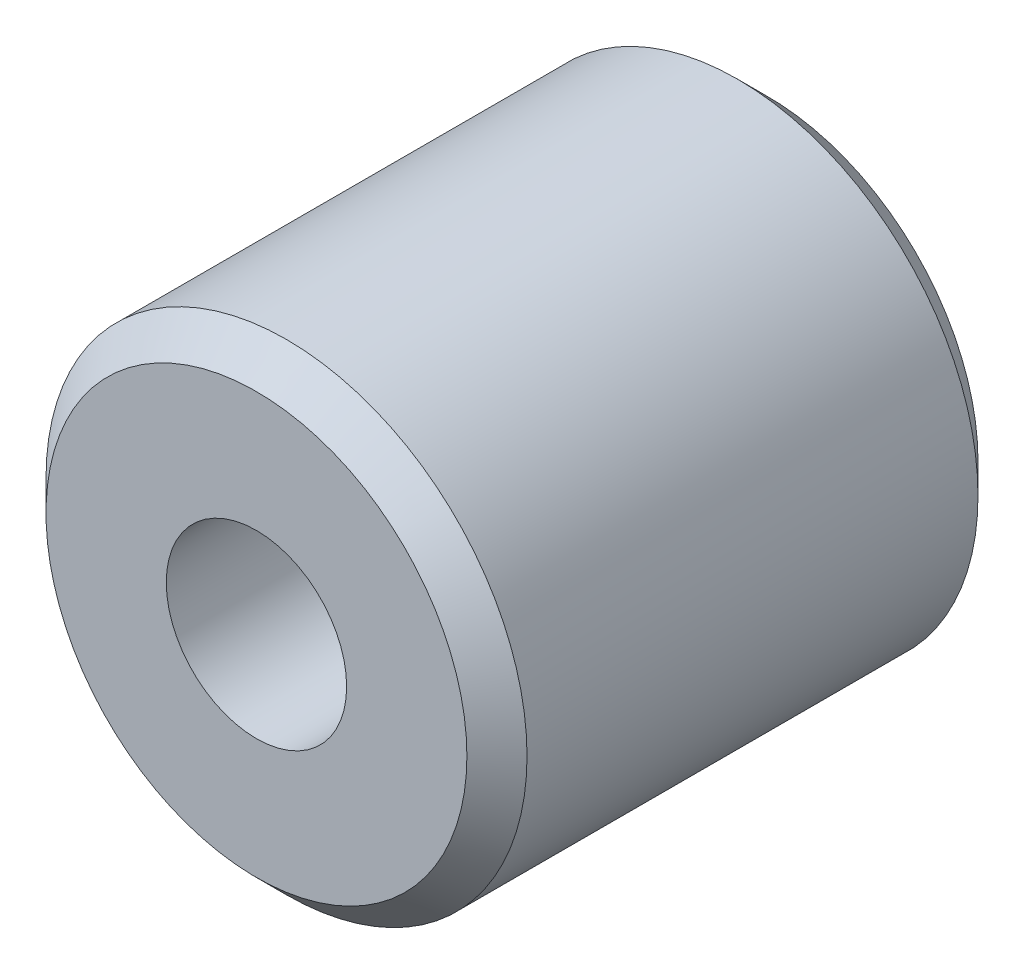
ISO-10303-21;
HEADER;
FILE_DESCRIPTION(('STEP AP214'),'2;1');
FILE_NAME('part.step','',(''),(''),'','','');
FILE_SCHEMA(('AUTOMOTIVE_DESIGN { 1 0 10303 214 1 1 1 1 }'));
ENDSEC;
DATA;
#1=APPLICATION_CONTEXT('core data for automotive mechanical design processes');
#2=APPLICATION_PROTOCOL_DEFINITION('international standard','automotive_design',2000,#1);
#3=PRODUCT_CONTEXT('',#1,'mechanical');
#4=PRODUCT('Part','Part','',(#3));
#5=PRODUCT_RELATED_PRODUCT_CATEGORY('part','',(#4));
#6=PRODUCT_DEFINITION_FORMATION('','',#4);
#7=PRODUCT_DEFINITION_CONTEXT('part definition',#1,'design');
#8=PRODUCT_DEFINITION('design','',#6,#7);
#9=PRODUCT_DEFINITION_SHAPE('','',#8);
#10=(LENGTH_UNIT() NAMED_UNIT(*) SI_UNIT(.MILLI.,.METRE.));
#11=(NAMED_UNIT(*) PLANE_ANGLE_UNIT() SI_UNIT($,.RADIAN.));
#12=(NAMED_UNIT(*) SI_UNIT($,.STERADIAN.) SOLID_ANGLE_UNIT());
#13=UNCERTAINTY_MEASURE_WITH_UNIT(LENGTH_MEASURE(1.E-05),#10,'distance_accuracy_value','');
#14=(GEOMETRIC_REPRESENTATION_CONTEXT(3) GLOBAL_UNCERTAINTY_ASSIGNED_CONTEXT((#13)) GLOBAL_UNIT_ASSIGNED_CONTEXT((#10,
#11,#12)) REPRESENTATION_CONTEXT('',''));
#15=CARTESIAN_POINT('',(0.,0.,0.));
#16=DIRECTION('',(0.,0.,1.));
#17=DIRECTION('',(1.,0.,0.));
#18=AXIS2_PLACEMENT_3D('',#15,#16,#17);
#19=CARTESIAN_POINT('',(0.,0.,-8.5));
#20=DIRECTION('',(0.,0.,1.));
#21=DIRECTION('',(1.,0.,0.));
#22=AXIS2_PLACEMENT_3D('',#19,#20,#21);
#23=CYLINDRICAL_SURFACE('',#22,4.);
#24=CARTESIAN_POINT('',(0.,0.,-0.500000000000002));
#25=DIRECTION('',(0.,0.,1.));
#26=DIRECTION('',(1.,0.,0.));
#27=AXIS2_PLACEMENT_3D('',#24,#25,#26);
#28=CIRCLE('',#27,4.);
#29=CARTESIAN_POINT('',(4.,0.,-0.500000000000002));
#30=VERTEX_POINT('',#29);
#31=EDGE_CURVE('E50',#30,#30,#28,.F.);
#32=ORIENTED_EDGE('',*,*,#31,.T.);
#33=EDGE_LOOP('',(#32));
#34=FACE_BOUND('',#33,.T.);
#35=CARTESIAN_POINT('',(0.,0.,-8.));
#36=DIRECTION('',(0.,0.,1.));
#37=DIRECTION('',(1.,0.,0.));
#38=AXIS2_PLACEMENT_3D('',#35,#36,#37);
#39=CIRCLE('',#38,4.);
#40=CARTESIAN_POINT('',(4.,0.,-8.));
#41=VERTEX_POINT('',#40);
#42=EDGE_CURVE('E51',#41,#41,#39,.T.);
#43=ORIENTED_EDGE('',*,*,#42,.T.);
#44=EDGE_LOOP('',(#43));
#45=FACE_BOUND('',#44,.T.);
#46=ADVANCED_FACE('F39',(#34,#45),#23,.T.);
#47=CARTESIAN_POINT('',(0.,0.,-8.5));
#48=DIRECTION('',(0.,0.,1.));
#49=DIRECTION('',(1.,0.,0.));
#50=AXIS2_PLACEMENT_3D('',#47,#48,#49);
#51=PLANE('',#50);
#52=CARTESIAN_POINT('',(0.,0.,-8.5));
#53=DIRECTION('',(0.,0.,1.));
#54=DIRECTION('',(1.,0.,0.));
#55=AXIS2_PLACEMENT_3D('',#52,#53,#54);
#56=CIRCLE('',#55,3.5);
#57=CARTESIAN_POINT('',(3.5,0.,-8.5));
#58=VERTEX_POINT('',#57);
#59=EDGE_CURVE('E10',#58,#58,#56,.F.);
#60=ORIENTED_EDGE('',*,*,#59,.T.);
#61=EDGE_LOOP('',(#60));
#62=FACE_BOUND('',#61,.T.);
#63=CARTESIAN_POINT('',(0.,0.,-8.5));
#64=DIRECTION('',(0.,0.,1.));
#65=DIRECTION('',(1.,0.,0.));
#66=AXIS2_PLACEMENT_3D('',#63,#64,#65);
#67=CIRCLE('',#66,1.5);
#68=CARTESIAN_POINT('',(1.5,0.,-8.5));
#69=VERTEX_POINT('',#68);
#70=EDGE_CURVE('E58',#69,#69,#67,.T.);
#71=ORIENTED_EDGE('',*,*,#70,.T.);
#72=EDGE_LOOP('',(#71));
#73=FACE_BOUND('',#72,.T.);
#74=ADVANCED_FACE('F70',(#62,#73),#51,.F.);
#75=CARTESIAN_POINT('',(0.,0.,0.));
#76=DIRECTION('',(0.,0.,1.));
#77=DIRECTION('',(1.,0.,0.));
#78=AXIS2_PLACEMENT_3D('',#75,#76,#77);
#79=PLANE('',#78);
#80=CARTESIAN_POINT('',(0.,0.,0.));
#81=DIRECTION('',(0.,0.,1.));
#82=DIRECTION('',(1.,0.,0.));
#83=AXIS2_PLACEMENT_3D('',#80,#81,#82);
#84=CIRCLE('',#83,3.5);
#85=CARTESIAN_POINT('',(3.5,0.,0.));
#86=VERTEX_POINT('',#85);
#87=EDGE_CURVE('E54',#86,#86,#84,.T.);
#88=ORIENTED_EDGE('',*,*,#87,.T.);
#89=EDGE_LOOP('',(#88));
#90=FACE_BOUND('',#89,.T.);
#91=CARTESIAN_POINT('',(0.,0.,0.));
#92=DIRECTION('',(0.,0.,1.));
#93=DIRECTION('',(1.,0.,0.));
#94=AXIS2_PLACEMENT_3D('',#91,#92,#93);
#95=CIRCLE('',#94,1.5);
#96=CARTESIAN_POINT('',(1.5,0.,0.));
#97=VERTEX_POINT('',#96);
#98=EDGE_CURVE('E64',#97,#97,#95,.T.);
#99=ORIENTED_EDGE('',*,*,#98,.F.);
#100=EDGE_LOOP('',(#99));
#101=FACE_BOUND('',#100,.T.);
#102=ADVANCED_FACE('F71',(#90,#101),#79,.T.);
#103=CARTESIAN_POINT('',(0.,0.,-8.5));
#104=DIRECTION('',(0.,0.,1.));
#105=DIRECTION('',(1.,0.,0.));
#106=AXIS2_PLACEMENT_3D('',#103,#104,#105);
#107=CYLINDRICAL_SURFACE('',#106,1.5);
#108=ORIENTED_EDGE('',*,*,#70,.F.);
#109=EDGE_LOOP('',(#108));
#110=FACE_BOUND('',#109,.T.);
#111=ORIENTED_EDGE('',*,*,#98,.T.);
#112=EDGE_LOOP('',(#111));
#113=FACE_BOUND('',#112,.T.);
#114=ADVANCED_FACE('F67',(#110,#113),#107,.F.);
#115=CARTESIAN_POINT('',(0.,0.,0.));
#116=DIRECTION('',(0.,0.,-1.));
#117=DIRECTION('',(-1.,0.,0.));
#118=AXIS2_PLACEMENT_3D('',#115,#116,#117);
#119=CONICAL_SURFACE('',#118,3.5,0.785398163397447);
#120=ORIENTED_EDGE('',*,*,#31,.F.);
#121=EDGE_LOOP('',(#120));
#122=FACE_BOUND('',#121,.T.);
#123=ORIENTED_EDGE('',*,*,#87,.F.);
#124=EDGE_LOOP('',(#123));
#125=FACE_BOUND('',#124,.T.);
#126=ADVANCED_FACE('F75',(#122,#125),#119,.T.);
#127=CARTESIAN_POINT('',(0.,0.,-8.));
#128=DIRECTION('',(0.,0.,1.));
#129=DIRECTION('',(1.,0.,0.));
#130=AXIS2_PLACEMENT_3D('',#127,#128,#129);
#131=CONICAL_SURFACE('',#130,4.,0.785398163397451);
#132=ORIENTED_EDGE('',*,*,#59,.F.);
#133=EDGE_LOOP('',(#132));
#134=FACE_BOUND('',#133,.T.);
#135=ORIENTED_EDGE('',*,*,#42,.F.);
#136=EDGE_LOOP('',(#135));
#137=FACE_BOUND('',#136,.T.);
#138=ADVANCED_FACE('F45',(#134,#137),#131,.T.);
#139=CLOSED_SHELL('',(#46,#74,#102,#114,#126,#138));
#140=MANIFOLD_SOLID_BREP('B2',#139);
#141=ADVANCED_BREP_SHAPE_REPRESENTATION('',(#18,#140),#14);
#142=SHAPE_DEFINITION_REPRESENTATION(#9,#141);
ENDSEC;
END-ISO-10303-21;
